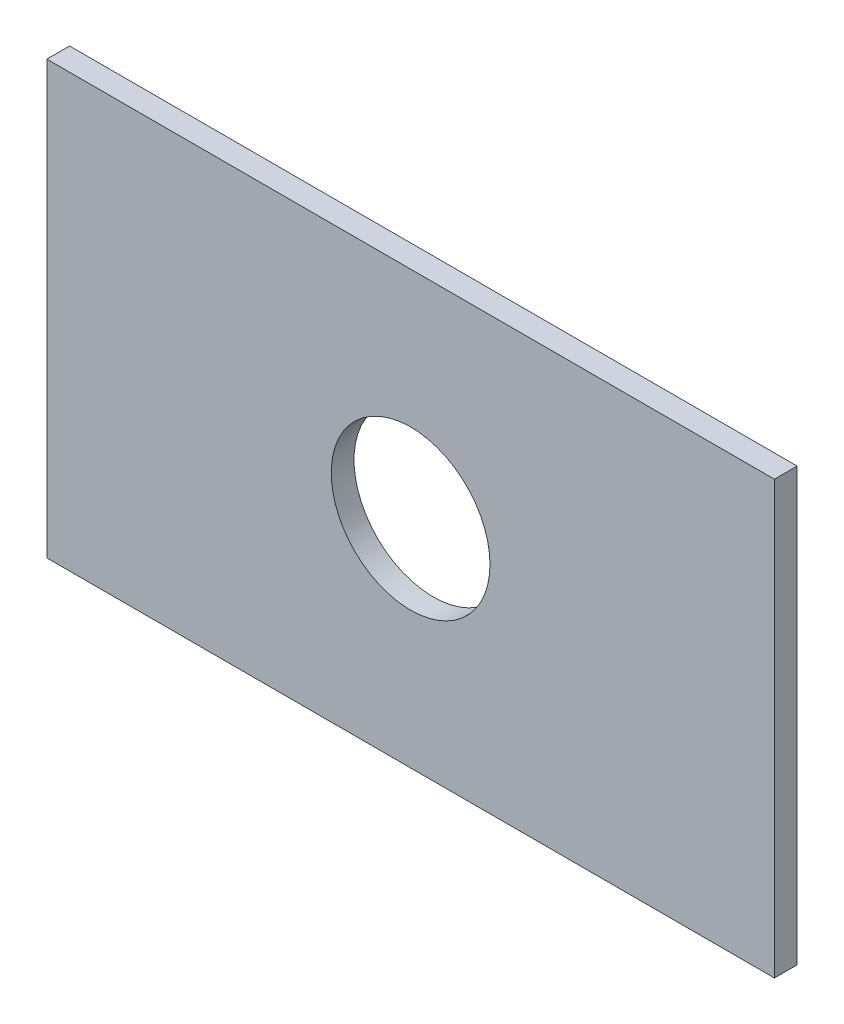
ISO-10303-21;
HEADER;
FILE_DESCRIPTION(('STEP AP214'),'2;1');
FILE_NAME('part.step','',(''),(''),'','','');
FILE_SCHEMA(('AUTOMOTIVE_DESIGN { 1 0 10303 214 1 1 1 1 }'));
ENDSEC;
DATA;
#1=APPLICATION_CONTEXT('core data for automotive mechanical design processes');
#2=APPLICATION_PROTOCOL_DEFINITION('international standard','automotive_design',2000,#1);
#3=PRODUCT_CONTEXT('',#1,'mechanical');
#4=PRODUCT('Part','Part','',(#3));
#5=PRODUCT_RELATED_PRODUCT_CATEGORY('part','',(#4));
#6=PRODUCT_DEFINITION_FORMATION('','',#4);
#7=PRODUCT_DEFINITION_CONTEXT('part definition',#1,'design');
#8=PRODUCT_DEFINITION('design','',#6,#7);
#9=PRODUCT_DEFINITION_SHAPE('','',#8);
#10=(LENGTH_UNIT() NAMED_UNIT(*) SI_UNIT(.MILLI.,.METRE.));
#11=(NAMED_UNIT(*) PLANE_ANGLE_UNIT() SI_UNIT($,.RADIAN.));
#12=(NAMED_UNIT(*) SI_UNIT($,.STERADIAN.) SOLID_ANGLE_UNIT());
#13=UNCERTAINTY_MEASURE_WITH_UNIT(LENGTH_MEASURE(1.E-05),#10,'distance_accuracy_value','');
#14=(GEOMETRIC_REPRESENTATION_CONTEXT(3) GLOBAL_UNCERTAINTY_ASSIGNED_CONTEXT((#13)) GLOBAL_UNIT_ASSIGNED_CONTEXT((#10,
#11,#12)) REPRESENTATION_CONTEXT('',''));
#15=CARTESIAN_POINT('',(0.,0.,0.));
#16=DIRECTION('',(0.,0.,1.));
#17=DIRECTION('',(1.,0.,0.));
#18=AXIS2_PLACEMENT_3D('',#15,#16,#17);
#19=CARTESIAN_POINT('',(101.6,-60.325,6.35));
#20=DIRECTION('',(-1.,0.,0.));
#21=DIRECTION('',(0.,0.,1.));
#22=AXIS2_PLACEMENT_3D('',#19,#20,#21);
#23=PLANE('',#22);
#24=DIRECTION('',(0.,1.,0.));
#25=VECTOR('',#24,1.);
#26=CARTESIAN_POINT('',(101.6,-60.325,0.));
#27=LINE('',#26,#25);
#28=CARTESIAN_POINT('',(101.6,-60.325,0.));
#29=VERTEX_POINT('',#28);
#30=CARTESIAN_POINT('',(101.6,60.325,0.));
#31=VERTEX_POINT('',#30);
#32=EDGE_CURVE('E100',#29,#31,#27,.T.);
#33=ORIENTED_EDGE('',*,*,#32,.T.);
#34=DIRECTION('',(0.,0.,-1.));
#35=VECTOR('',#34,1.);
#36=CARTESIAN_POINT('',(101.6,60.325,6.35));
#37=LINE('',#36,#35);
#38=CARTESIAN_POINT('',(101.6,60.325,6.35));
#39=VERTEX_POINT('',#38);
#40=EDGE_CURVE('E11',#39,#31,#37,.T.);
#41=ORIENTED_EDGE('',*,*,#40,.F.);
#42=DIRECTION('',(0.,1.,0.));
#43=VECTOR('',#42,1.);
#44=CARTESIAN_POINT('',(101.6,-60.325,6.35));
#45=LINE('',#44,#43);
#46=CARTESIAN_POINT('',(101.6,-60.325,6.35));
#47=VERTEX_POINT('',#46);
#48=EDGE_CURVE('E88',#47,#39,#45,.T.);
#49=ORIENTED_EDGE('',*,*,#48,.F.);
#50=DIRECTION('',(0.,0.,-1.));
#51=VECTOR('',#50,1.);
#52=CARTESIAN_POINT('',(101.6,-60.325,6.35));
#53=LINE('',#52,#51);
#54=EDGE_CURVE('E96',#47,#29,#53,.T.);
#55=ORIENTED_EDGE('',*,*,#54,.T.);
#56=EDGE_LOOP('',(#33,#41,#49,#55));
#57=FACE_BOUND('',#56,.T.);
#58=ADVANCED_FACE('F37',(#57),#23,.F.);
#59=CARTESIAN_POINT('',(-101.6,60.325,6.35));
#60=DIRECTION('',(0.,-1.,0.));
#61=DIRECTION('',(0.,0.,-1.));
#62=AXIS2_PLACEMENT_3D('',#59,#60,#61);
#63=PLANE('',#62);
#64=DIRECTION('',(-1.,0.,0.));
#65=VECTOR('',#64,1.);
#66=CARTESIAN_POINT('',(-101.6,60.325,0.));
#67=LINE('',#66,#65);
#68=CARTESIAN_POINT('',(-101.6,60.325,0.));
#69=VERTEX_POINT('',#68);
#70=EDGE_CURVE('E92',#31,#69,#67,.T.);
#71=ORIENTED_EDGE('',*,*,#70,.T.);
#72=DIRECTION('',(0.,0.,-1.));
#73=VECTOR('',#72,1.);
#74=CARTESIAN_POINT('',(-101.6,60.325,6.35));
#75=LINE('',#74,#73);
#76=CARTESIAN_POINT('',(-101.6,60.325,6.35));
#77=VERTEX_POINT('',#76);
#78=EDGE_CURVE('E45',#77,#69,#75,.T.);
#79=ORIENTED_EDGE('',*,*,#78,.F.);
#80=DIRECTION('',(-1.,0.,0.));
#81=VECTOR('',#80,1.);
#82=CARTESIAN_POINT('',(-101.6,60.325,6.35));
#83=LINE('',#82,#81);
#84=EDGE_CURVE('E83',#39,#77,#83,.T.);
#85=ORIENTED_EDGE('',*,*,#84,.F.);
#86=ORIENTED_EDGE('',*,*,#40,.T.);
#87=EDGE_LOOP('',(#71,#79,#85,#86));
#88=FACE_BOUND('',#87,.T.);
#89=ADVANCED_FACE('F91',(#88),#63,.F.);
#90=CARTESIAN_POINT('',(-101.6,-60.325,6.35));
#91=DIRECTION('',(1.,0.,0.));
#92=DIRECTION('',(0.,0.,-1.));
#93=AXIS2_PLACEMENT_3D('',#90,#91,#92);
#94=PLANE('',#93);
#95=DIRECTION('',(0.,-1.,0.));
#96=VECTOR('',#95,1.);
#97=CARTESIAN_POINT('',(-101.6,-60.325,0.));
#98=LINE('',#97,#96);
#99=CARTESIAN_POINT('',(-101.6,-60.325,0.));
#100=VERTEX_POINT('',#99);
#101=EDGE_CURVE('E70',#69,#100,#98,.T.);
#102=ORIENTED_EDGE('',*,*,#101,.T.);
#103=DIRECTION('',(0.,0.,-1.));
#104=VECTOR('',#103,1.);
#105=CARTESIAN_POINT('',(-101.6,-60.325,6.35));
#106=LINE('',#105,#104);
#107=CARTESIAN_POINT('',(-101.6,-60.325,6.35));
#108=VERTEX_POINT('',#107);
#109=EDGE_CURVE('E93',#108,#100,#106,.T.);
#110=ORIENTED_EDGE('',*,*,#109,.F.);
#111=DIRECTION('',(0.,-1.,0.));
#112=VECTOR('',#111,1.);
#113=CARTESIAN_POINT('',(-101.6,-60.325,6.35));
#114=LINE('',#113,#112);
#115=EDGE_CURVE('E86',#77,#108,#114,.T.);
#116=ORIENTED_EDGE('',*,*,#115,.F.);
#117=ORIENTED_EDGE('',*,*,#78,.T.);
#118=EDGE_LOOP('',(#102,#110,#116,#117));
#119=FACE_BOUND('',#118,.T.);
#120=ADVANCED_FACE('F94',(#119),#94,.F.);
#121=CARTESIAN_POINT('',(-101.6,-60.325,6.35));
#122=DIRECTION('',(0.,1.,0.));
#123=DIRECTION('',(0.,0.,1.));
#124=AXIS2_PLACEMENT_3D('',#121,#122,#123);
#125=PLANE('',#124);
#126=DIRECTION('',(1.,0.,0.));
#127=VECTOR('',#126,1.);
#128=CARTESIAN_POINT('',(-101.6,-60.325,0.));
#129=LINE('',#128,#127);
#130=EDGE_CURVE('E76',#100,#29,#129,.T.);
#131=ORIENTED_EDGE('',*,*,#130,.T.);
#132=ORIENTED_EDGE('',*,*,#54,.F.);
#133=DIRECTION('',(1.,0.,0.));
#134=VECTOR('',#133,1.);
#135=CARTESIAN_POINT('',(-101.6,-60.325,6.35));
#136=LINE('',#135,#134);
#137=EDGE_CURVE('E53',#108,#47,#136,.T.);
#138=ORIENTED_EDGE('',*,*,#137,.F.);
#139=ORIENTED_EDGE('',*,*,#109,.T.);
#140=EDGE_LOOP('',(#131,#132,#138,#139));
#141=FACE_BOUND('',#140,.T.);
#142=ADVANCED_FACE('F108',(#141),#125,.F.);
#143=CARTESIAN_POINT('',(0.,0.,6.35));
#144=DIRECTION('',(0.,0.,-1.));
#145=DIRECTION('',(-1.,0.,0.));
#146=AXIS2_PLACEMENT_3D('',#143,#144,#145);
#147=PLANE('',#146);
#148=CARTESIAN_POINT('',(0.,0.,6.35));
#149=DIRECTION('',(0.,0.,1.));
#150=DIRECTION('',(1.,0.,0.));
#151=AXIS2_PLACEMENT_3D('',#148,#149,#150);
#152=CIRCLE('',#151,22.1659311446517);
#153=CARTESIAN_POINT('',(22.1659311446517,0.,6.35));
#154=VERTEX_POINT('',#153);
#155=EDGE_CURVE('E114',#154,#154,#152,.T.);
#156=ORIENTED_EDGE('',*,*,#155,.F.);
#157=EDGE_LOOP('',(#156));
#158=FACE_BOUND('',#157,.T.);
#159=ORIENTED_EDGE('',*,*,#48,.T.);
#160=ORIENTED_EDGE('',*,*,#84,.T.);
#161=ORIENTED_EDGE('',*,*,#115,.T.);
#162=ORIENTED_EDGE('',*,*,#137,.T.);
#163=EDGE_LOOP('',(#159,#160,#161,#162));
#164=FACE_BOUND('',#163,.T.);
#165=ADVANCED_FACE('F84',(#158,#164),#147,.F.);
#166=CARTESIAN_POINT('',(0.,0.,0.));
#167=DIRECTION('',(0.,0.,-1.));
#168=DIRECTION('',(-1.,0.,0.));
#169=AXIS2_PLACEMENT_3D('',#166,#167,#168);
#170=PLANE('',#169);
#171=CARTESIAN_POINT('',(0.,0.,0.));
#172=DIRECTION('',(0.,0.,1.));
#173=DIRECTION('',(1.,0.,0.));
#174=AXIS2_PLACEMENT_3D('',#171,#172,#173);
#175=CIRCLE('',#174,22.1659311446517);
#176=CARTESIAN_POINT('',(22.1659311446517,0.,0.));
#177=VERTEX_POINT('',#176);
#178=EDGE_CURVE('E103',#177,#177,#175,.T.);
#179=ORIENTED_EDGE('',*,*,#178,.T.);
#180=EDGE_LOOP('',(#179));
#181=FACE_BOUND('',#180,.T.);
#182=ORIENTED_EDGE('',*,*,#32,.F.);
#183=ORIENTED_EDGE('',*,*,#130,.F.);
#184=ORIENTED_EDGE('',*,*,#101,.F.);
#185=ORIENTED_EDGE('',*,*,#70,.F.);
#186=EDGE_LOOP('',(#182,#183,#184,#185));
#187=FACE_BOUND('',#186,.T.);
#188=ADVANCED_FACE('F111',(#181,#187),#170,.T.);
#189=CARTESIAN_POINT('',(0.,0.,0.));
#190=DIRECTION('',(0.,0.,1.));
#191=DIRECTION('',(1.,0.,0.));
#192=AXIS2_PLACEMENT_3D('',#189,#190,#191);
#193=CYLINDRICAL_SURFACE('',#192,22.1659311446517);
#194=ORIENTED_EDGE('',*,*,#178,.F.);
#195=EDGE_LOOP('',(#194));
#196=FACE_BOUND('',#195,.T.);
#197=ORIENTED_EDGE('',*,*,#155,.T.);
#198=EDGE_LOOP('',(#197));
#199=FACE_BOUND('',#198,.T.);
#200=ADVANCED_FACE('F121',(#196,#199),#193,.F.);
#201=CLOSED_SHELL('',(#58,#89,#120,#142,#165,#188,#200));
#202=MANIFOLD_SOLID_BREP('B2',#201);
#203=ADVANCED_BREP_SHAPE_REPRESENTATION('',(#18,#202),#14);
#204=SHAPE_DEFINITION_REPRESENTATION(#9,#203);
ENDSEC;
END-ISO-10303-21;
